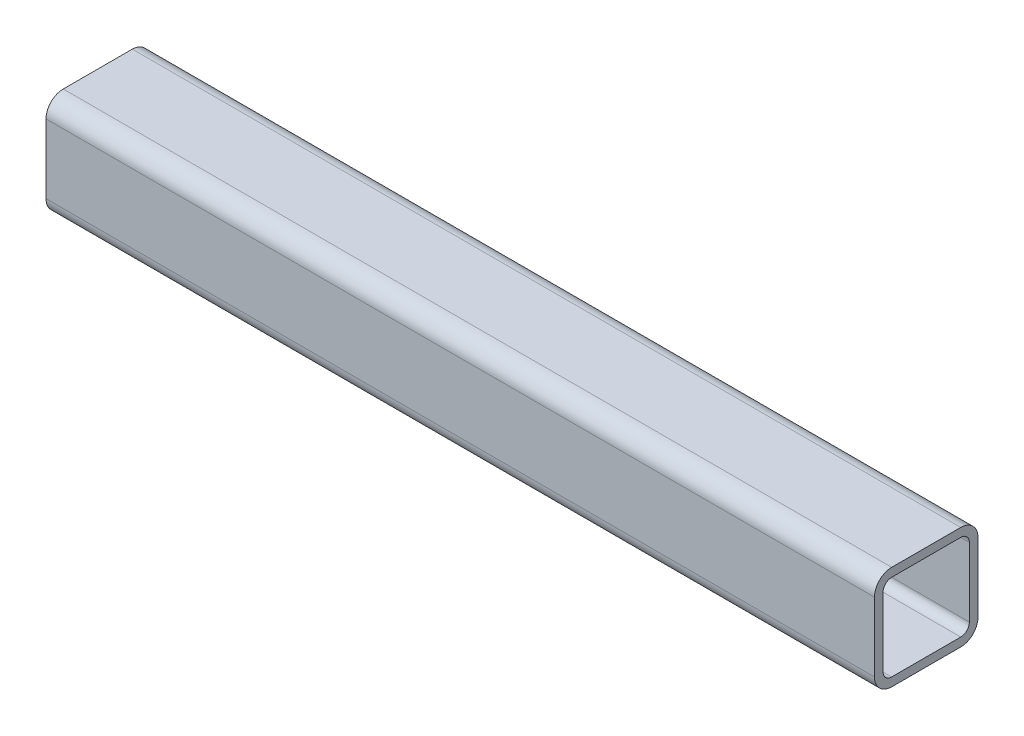
ISO-10303-21;
HEADER;
FILE_DESCRIPTION(('STEP AP214'),'2;1');
FILE_NAME('part.step','',(''),(''),'','','');
FILE_SCHEMA(('AUTOMOTIVE_DESIGN { 1 0 10303 214 1 1 1 1 }'));
ENDSEC;
DATA;
#1=APPLICATION_CONTEXT('core data for automotive mechanical design processes');
#2=APPLICATION_PROTOCOL_DEFINITION('international standard','automotive_design',2000,#1);
#3=PRODUCT_CONTEXT('',#1,'mechanical');
#4=PRODUCT('Part','Part','',(#3));
#5=PRODUCT_RELATED_PRODUCT_CATEGORY('part','',(#4));
#6=PRODUCT_DEFINITION_FORMATION('','',#4);
#7=PRODUCT_DEFINITION_CONTEXT('part definition',#1,'design');
#8=PRODUCT_DEFINITION('design','',#6,#7);
#9=PRODUCT_DEFINITION_SHAPE('','',#8);
#10=(LENGTH_UNIT() NAMED_UNIT(*) SI_UNIT(.MILLI.,.METRE.));
#11=(NAMED_UNIT(*) PLANE_ANGLE_UNIT() SI_UNIT($,.RADIAN.));
#12=(NAMED_UNIT(*) SI_UNIT($,.STERADIAN.) SOLID_ANGLE_UNIT());
#13=UNCERTAINTY_MEASURE_WITH_UNIT(LENGTH_MEASURE(1.E-05),#10,'distance_accuracy_value','');
#14=(GEOMETRIC_REPRESENTATION_CONTEXT(3) GLOBAL_UNCERTAINTY_ASSIGNED_CONTEXT((#13)) GLOBAL_UNIT_ASSIGNED_CONTEXT((#10,
#11,#12)) REPRESENTATION_CONTEXT('',''));
#15=CARTESIAN_POINT('',(0.,0.,0.));
#16=DIRECTION('',(0.,0.,1.));
#17=DIRECTION('',(1.,0.,0.));
#18=AXIS2_PLACEMENT_3D('',#15,#16,#17);
#19=CARTESIAN_POINT('',(-609.6,25.4,25.4));
#20=DIRECTION('',(1.,0.,0.));
#21=DIRECTION('',(0.,0.,-1.));
#22=AXIS2_PLACEMENT_3D('',#19,#20,#21);
#23=CYLINDRICAL_SURFACE('',#22,12.7);
#24=CARTESIAN_POINT('',(0.,25.4,25.4));
#25=DIRECTION('',(-1.,0.,0.));
#26=DIRECTION('',(0.,0.,1.));
#27=AXIS2_PLACEMENT_3D('',#24,#25,#26);
#28=CIRCLE('',#27,12.7);
#29=CARTESIAN_POINT('',(0.,25.4,38.1));
#30=VERTEX_POINT('',#29);
#31=CARTESIAN_POINT('',(0.,38.1,25.4));
#32=VERTEX_POINT('',#31);
#33=EDGE_CURVE('E233',#30,#32,#28,.T.);
#34=ORIENTED_EDGE('',*,*,#33,.T.);
#35=DIRECTION('',(1.,0.,0.));
#36=VECTOR('',#35,1.);
#37=CARTESIAN_POINT('',(-609.6,38.1,25.4));
#38=LINE('',#37,#36);
#39=CARTESIAN_POINT('',(-609.6,38.1,25.4));
#40=VERTEX_POINT('',#39);
#41=EDGE_CURVE('E12',#40,#32,#38,.T.);
#42=ORIENTED_EDGE('',*,*,#41,.F.);
#43=CARTESIAN_POINT('',(-609.6,25.4,25.4));
#44=DIRECTION('',(-1.,0.,0.));
#45=DIRECTION('',(0.,0.,1.));
#46=AXIS2_PLACEMENT_3D('',#43,#44,#45);
#47=CIRCLE('',#46,12.7);
#48=CARTESIAN_POINT('',(-609.6,25.4,38.1));
#49=VERTEX_POINT('',#48);
#50=EDGE_CURVE('E311',#49,#40,#47,.T.);
#51=ORIENTED_EDGE('',*,*,#50,.F.);
#52=DIRECTION('',(1.,0.,0.));
#53=VECTOR('',#52,1.);
#54=CARTESIAN_POINT('',(-609.6,25.4,38.1));
#55=LINE('',#54,#53);
#56=EDGE_CURVE('E248',#49,#30,#55,.T.);
#57=ORIENTED_EDGE('',*,*,#56,.T.);
#58=EDGE_LOOP('',(#34,#42,#51,#57));
#59=FACE_BOUND('',#58,.T.);
#60=ADVANCED_FACE('F61',(#59),#23,.T.);
#61=CARTESIAN_POINT('',(-609.6,38.1,25.4));
#62=DIRECTION('',(0.,-1.,0.));
#63=DIRECTION('',(0.,0.,-1.));
#64=AXIS2_PLACEMENT_3D('',#61,#62,#63);
#65=PLANE('',#64);
#66=DIRECTION('',(0.,0.,-1.));
#67=VECTOR('',#66,1.);
#68=CARTESIAN_POINT('',(0.,38.1,25.4));
#69=LINE('',#68,#67);
#70=CARTESIAN_POINT('',(0.,38.1,-25.4));
#71=VERTEX_POINT('',#70);
#72=EDGE_CURVE('E236',#32,#71,#69,.T.);
#73=ORIENTED_EDGE('',*,*,#72,.T.);
#74=DIRECTION('',(1.,0.,0.));
#75=VECTOR('',#74,1.);
#76=CARTESIAN_POINT('',(-609.6,38.1,-25.4));
#77=LINE('',#76,#75);
#78=CARTESIAN_POINT('',(-609.6,38.1,-25.4));
#79=VERTEX_POINT('',#78);
#80=EDGE_CURVE('E71',#79,#71,#77,.T.);
#81=ORIENTED_EDGE('',*,*,#80,.F.);
#82=DIRECTION('',(0.,0.,-1.));
#83=VECTOR('',#82,1.);
#84=CARTESIAN_POINT('',(-609.6,38.1,25.4));
#85=LINE('',#84,#83);
#86=EDGE_CURVE('E313',#40,#79,#85,.T.);
#87=ORIENTED_EDGE('',*,*,#86,.F.);
#88=ORIENTED_EDGE('',*,*,#41,.T.);
#89=EDGE_LOOP('',(#73,#81,#87,#88));
#90=FACE_BOUND('',#89,.T.);
#91=ADVANCED_FACE('F348',(#90),#65,.F.);
#92=CARTESIAN_POINT('',(-609.6,25.4,-25.4));
#93=DIRECTION('',(1.,0.,0.));
#94=DIRECTION('',(0.,0.,-1.));
#95=AXIS2_PLACEMENT_3D('',#92,#93,#94);
#96=CYLINDRICAL_SURFACE('',#95,12.7);
#97=CARTESIAN_POINT('',(0.,25.4,-25.4));
#98=DIRECTION('',(-1.,0.,0.));
#99=DIRECTION('',(0.,0.,1.));
#100=AXIS2_PLACEMENT_3D('',#97,#98,#99);
#101=CIRCLE('',#100,12.7);
#102=CARTESIAN_POINT('',(0.,25.4,-38.1));
#103=VERTEX_POINT('',#102);
#104=EDGE_CURVE('E238',#71,#103,#101,.T.);
#105=ORIENTED_EDGE('',*,*,#104,.T.);
#106=DIRECTION('',(1.,0.,0.));
#107=VECTOR('',#106,1.);
#108=CARTESIAN_POINT('',(-609.6,25.4,-38.1));
#109=LINE('',#108,#107);
#110=CARTESIAN_POINT('',(-609.6,25.4,-38.1));
#111=VERTEX_POINT('',#110);
#112=EDGE_CURVE('E255',#111,#103,#109,.T.);
#113=ORIENTED_EDGE('',*,*,#112,.F.);
#114=CARTESIAN_POINT('',(-609.6,25.4,-25.4));
#115=DIRECTION('',(-1.,0.,0.));
#116=DIRECTION('',(0.,0.,1.));
#117=AXIS2_PLACEMENT_3D('',#114,#115,#116);
#118=CIRCLE('',#117,12.7);
#119=EDGE_CURVE('E315',#79,#111,#118,.T.);
#120=ORIENTED_EDGE('',*,*,#119,.F.);
#121=ORIENTED_EDGE('',*,*,#80,.T.);
#122=EDGE_LOOP('',(#105,#113,#120,#121));
#123=FACE_BOUND('',#122,.T.);
#124=ADVANCED_FACE('F353',(#123),#96,.T.);
#125=CARTESIAN_POINT('',(-609.6,-25.4,-38.1));
#126=DIRECTION('',(0.,0.,1.));
#127=DIRECTION('',(1.,0.,0.));
#128=AXIS2_PLACEMENT_3D('',#125,#126,#127);
#129=PLANE('',#128);
#130=DIRECTION('',(0.,-1.,0.));
#131=VECTOR('',#130,1.);
#132=CARTESIAN_POINT('',(0.,-25.4,-38.1));
#133=LINE('',#132,#131);
#134=CARTESIAN_POINT('',(0.,-25.4,-38.1));
#135=VERTEX_POINT('',#134);
#136=EDGE_CURVE('E240',#103,#135,#133,.T.);
#137=ORIENTED_EDGE('',*,*,#136,.T.);
#138=DIRECTION('',(1.,0.,0.));
#139=VECTOR('',#138,1.);
#140=CARTESIAN_POINT('',(-609.6,-25.4,-38.1));
#141=LINE('',#140,#139);
#142=CARTESIAN_POINT('',(-609.6,-25.4,-38.1));
#143=VERTEX_POINT('',#142);
#144=EDGE_CURVE('E252',#143,#135,#141,.T.);
#145=ORIENTED_EDGE('',*,*,#144,.F.);
#146=DIRECTION('',(0.,-1.,0.));
#147=VECTOR('',#146,1.);
#148=CARTESIAN_POINT('',(-609.6,-25.4,-38.1));
#149=LINE('',#148,#147);
#150=EDGE_CURVE('E317',#111,#143,#149,.T.);
#151=ORIENTED_EDGE('',*,*,#150,.F.);
#152=ORIENTED_EDGE('',*,*,#112,.T.);
#153=EDGE_LOOP('',(#137,#145,#151,#152));
#154=FACE_BOUND('',#153,.T.);
#155=ADVANCED_FACE('F323',(#154),#129,.F.);
#156=CARTESIAN_POINT('',(-609.6,-25.4,-25.4));
#157=DIRECTION('',(1.,0.,0.));
#158=DIRECTION('',(0.,0.,-1.));
#159=AXIS2_PLACEMENT_3D('',#156,#157,#158);
#160=CYLINDRICAL_SURFACE('',#159,12.7);
#161=CARTESIAN_POINT('',(0.,-25.4,-25.4));
#162=DIRECTION('',(-1.,0.,0.));
#163=DIRECTION('',(0.,0.,1.));
#164=AXIS2_PLACEMENT_3D('',#161,#162,#163);
#165=CIRCLE('',#164,12.7);
#166=CARTESIAN_POINT('',(0.,-38.1,-25.4));
#167=VERTEX_POINT('',#166);
#168=EDGE_CURVE('E242',#135,#167,#165,.T.);
#169=ORIENTED_EDGE('',*,*,#168,.T.);
#170=DIRECTION('',(1.,0.,0.));
#171=VECTOR('',#170,1.);
#172=CARTESIAN_POINT('',(-609.6,-38.1,-25.4));
#173=LINE('',#172,#171);
#174=CARTESIAN_POINT('',(-609.6,-38.1,-25.4));
#175=VERTEX_POINT('',#174);
#176=EDGE_CURVE('E200',#175,#167,#173,.T.);
#177=ORIENTED_EDGE('',*,*,#176,.F.);
#178=CARTESIAN_POINT('',(-609.6,-25.4,-25.4));
#179=DIRECTION('',(-1.,0.,0.));
#180=DIRECTION('',(0.,0.,1.));
#181=AXIS2_PLACEMENT_3D('',#178,#179,#180);
#182=CIRCLE('',#181,12.7);
#183=EDGE_CURVE('E191',#143,#175,#182,.T.);
#184=ORIENTED_EDGE('',*,*,#183,.F.);
#185=ORIENTED_EDGE('',*,*,#144,.T.);
#186=EDGE_LOOP('',(#169,#177,#184,#185));
#187=FACE_BOUND('',#186,.T.);
#188=ADVANCED_FACE('F327',(#187),#160,.T.);
#189=CARTESIAN_POINT('',(-609.6,-38.1,-25.4));
#190=DIRECTION('',(0.,1.,0.));
#191=DIRECTION('',(0.,0.,1.));
#192=AXIS2_PLACEMENT_3D('',#189,#190,#191);
#193=PLANE('',#192);
#194=DIRECTION('',(0.,0.,1.));
#195=VECTOR('',#194,1.);
#196=CARTESIAN_POINT('',(0.,-38.1,-25.4));
#197=LINE('',#196,#195);
#198=CARTESIAN_POINT('',(0.,-38.1,25.4));
#199=VERTEX_POINT('',#198);
#200=EDGE_CURVE('E199',#167,#199,#197,.T.);
#201=ORIENTED_EDGE('',*,*,#200,.T.);
#202=DIRECTION('',(1.,0.,0.));
#203=VECTOR('',#202,1.);
#204=CARTESIAN_POINT('',(-609.6,-38.1,25.4));
#205=LINE('',#204,#203);
#206=CARTESIAN_POINT('',(-609.6,-38.1,25.4));
#207=VERTEX_POINT('',#206);
#208=EDGE_CURVE('E196',#207,#199,#205,.T.);
#209=ORIENTED_EDGE('',*,*,#208,.F.);
#210=DIRECTION('',(0.,0.,1.));
#211=VECTOR('',#210,1.);
#212=CARTESIAN_POINT('',(-609.6,-38.1,-25.4));
#213=LINE('',#212,#211);
#214=EDGE_CURVE('E185',#175,#207,#213,.T.);
#215=ORIENTED_EDGE('',*,*,#214,.F.);
#216=ORIENTED_EDGE('',*,*,#176,.T.);
#217=EDGE_LOOP('',(#201,#209,#215,#216));
#218=FACE_BOUND('',#217,.T.);
#219=ADVANCED_FACE('F197',(#218),#193,.F.);
#220=CARTESIAN_POINT('',(-609.6,-25.4,25.4));
#221=DIRECTION('',(1.,0.,0.));
#222=DIRECTION('',(0.,0.,-1.));
#223=AXIS2_PLACEMENT_3D('',#220,#221,#222);
#224=CYLINDRICAL_SURFACE('',#223,12.7);
#225=CARTESIAN_POINT('',(0.,-25.4,25.4));
#226=DIRECTION('',(-1.,0.,0.));
#227=DIRECTION('',(0.,0.,1.));
#228=AXIS2_PLACEMENT_3D('',#225,#226,#227);
#229=CIRCLE('',#228,12.7);
#230=CARTESIAN_POINT('',(0.,-25.4,38.1));
#231=VERTEX_POINT('',#230);
#232=EDGE_CURVE('E133',#199,#231,#229,.T.);
#233=ORIENTED_EDGE('',*,*,#232,.T.);
#234=DIRECTION('',(1.,0.,0.));
#235=VECTOR('',#234,1.);
#236=CARTESIAN_POINT('',(-609.6,-25.4,38.1));
#237=LINE('',#236,#235);
#238=CARTESIAN_POINT('',(-609.6,-25.4,38.1));
#239=VERTEX_POINT('',#238);
#240=EDGE_CURVE('E201',#239,#231,#237,.T.);
#241=ORIENTED_EDGE('',*,*,#240,.F.);
#242=CARTESIAN_POINT('',(-609.6,-25.4,25.4));
#243=DIRECTION('',(-1.,0.,0.));
#244=DIRECTION('',(0.,0.,1.));
#245=AXIS2_PLACEMENT_3D('',#242,#243,#244);
#246=CIRCLE('',#245,12.7);
#247=EDGE_CURVE('E189',#207,#239,#246,.T.);
#248=ORIENTED_EDGE('',*,*,#247,.F.);
#249=ORIENTED_EDGE('',*,*,#208,.T.);
#250=EDGE_LOOP('',(#233,#241,#248,#249));
#251=FACE_BOUND('',#250,.T.);
#252=ADVANCED_FACE('F203',(#251),#224,.T.);
#253=CARTESIAN_POINT('',(-609.6,25.4,-25.4));
#254=DIRECTION('',(1.,0.,0.));
#255=DIRECTION('',(0.,0.,-1.));
#256=AXIS2_PLACEMENT_3D('',#253,#254,#255);
#257=CYLINDRICAL_SURFACE('',#256,6.34999999999999);
#258=CARTESIAN_POINT('',(0.,25.4,-25.4));
#259=DIRECTION('',(-1.,0.,0.));
#260=DIRECTION('',(0.,0.,1.));
#261=AXIS2_PLACEMENT_3D('',#258,#259,#260);
#262=CIRCLE('',#261,6.34999999999999);
#263=CARTESIAN_POINT('',(0.,31.75,-25.4));
#264=VERTEX_POINT('',#263);
#265=CARTESIAN_POINT('',(0.,25.4,-31.75));
#266=VERTEX_POINT('',#265);
#267=EDGE_CURVE('E209',#264,#266,#262,.T.);
#268=ORIENTED_EDGE('',*,*,#267,.F.);
#269=DIRECTION('',(1.,0.,0.));
#270=VECTOR('',#269,1.);
#271=CARTESIAN_POINT('',(-609.6,31.75,-25.4));
#272=LINE('',#271,#270);
#273=CARTESIAN_POINT('',(-609.6,31.75,-25.4));
#274=VERTEX_POINT('',#273);
#275=EDGE_CURVE('E65',#274,#264,#272,.T.);
#276=ORIENTED_EDGE('',*,*,#275,.F.);
#277=CARTESIAN_POINT('',(-609.6,25.4,-25.4));
#278=DIRECTION('',(-1.,0.,0.));
#279=DIRECTION('',(0.,0.,1.));
#280=AXIS2_PLACEMENT_3D('',#277,#278,#279);
#281=CIRCLE('',#280,6.34999999999999);
#282=CARTESIAN_POINT('',(-609.6,25.4,-31.75));
#283=VERTEX_POINT('',#282);
#284=EDGE_CURVE('E247',#274,#283,#281,.T.);
#285=ORIENTED_EDGE('',*,*,#284,.T.);
#286=DIRECTION('',(1.,0.,0.));
#287=VECTOR('',#286,1.);
#288=CARTESIAN_POINT('',(-609.6,25.4,-31.75));
#289=LINE('',#288,#287);
#290=EDGE_CURVE('E205',#283,#266,#289,.T.);
#291=ORIENTED_EDGE('',*,*,#290,.T.);
#292=EDGE_LOOP('',(#268,#276,#285,#291));
#293=FACE_BOUND('',#292,.T.);
#294=ADVANCED_FACE('F63',(#293),#257,.F.);
#295=CARTESIAN_POINT('',(-609.6,31.75,25.4));
#296=DIRECTION('',(0.,-1.,0.));
#297=DIRECTION('',(0.,0.,-1.));
#298=AXIS2_PLACEMENT_3D('',#295,#296,#297);
#299=PLANE('',#298);
#300=DIRECTION('',(0.,0.,-1.));
#301=VECTOR('',#300,1.);
#302=CARTESIAN_POINT('',(0.,31.75,25.4));
#303=LINE('',#302,#301);
#304=CARTESIAN_POINT('',(0.,31.75,25.4));
#305=VERTEX_POINT('',#304);
#306=EDGE_CURVE('E212',#305,#264,#303,.T.);
#307=ORIENTED_EDGE('',*,*,#306,.F.);
#308=DIRECTION('',(1.,0.,0.));
#309=VECTOR('',#308,1.);
#310=CARTESIAN_POINT('',(-609.6,31.75,25.4));
#311=LINE('',#310,#309);
#312=CARTESIAN_POINT('',(-609.6,31.75,25.4));
#313=VERTEX_POINT('',#312);
#314=EDGE_CURVE('E270',#313,#305,#311,.T.);
#315=ORIENTED_EDGE('',*,*,#314,.F.);
#316=DIRECTION('',(0.,0.,-1.));
#317=VECTOR('',#316,1.);
#318=CARTESIAN_POINT('',(-609.6,31.75,25.4));
#319=LINE('',#318,#317);
#320=EDGE_CURVE('E279',#313,#274,#319,.T.);
#321=ORIENTED_EDGE('',*,*,#320,.T.);
#322=ORIENTED_EDGE('',*,*,#275,.T.);
#323=EDGE_LOOP('',(#307,#315,#321,#322));
#324=FACE_BOUND('',#323,.T.);
#325=ADVANCED_FACE('F277',(#324),#299,.T.);
#326=CARTESIAN_POINT('',(-609.6,25.4,25.4));
#327=DIRECTION('',(1.,0.,0.));
#328=DIRECTION('',(0.,0.,-1.));
#329=AXIS2_PLACEMENT_3D('',#326,#327,#328);
#330=CYLINDRICAL_SURFACE('',#329,6.34999999999999);
#331=CARTESIAN_POINT('',(0.,25.4,25.4));
#332=DIRECTION('',(-1.,0.,0.));
#333=DIRECTION('',(0.,0.,1.));
#334=AXIS2_PLACEMENT_3D('',#331,#332,#333);
#335=CIRCLE('',#334,6.34999999999999);
#336=CARTESIAN_POINT('',(0.,25.4,31.75));
#337=VERTEX_POINT('',#336);
#338=EDGE_CURVE('E215',#337,#305,#335,.T.);
#339=ORIENTED_EDGE('',*,*,#338,.F.);
#340=DIRECTION('',(1.,0.,0.));
#341=VECTOR('',#340,1.);
#342=CARTESIAN_POINT('',(-609.6,25.4,31.75));
#343=LINE('',#342,#341);
#344=CARTESIAN_POINT('',(-609.6,25.4,31.75));
#345=VERTEX_POINT('',#344);
#346=EDGE_CURVE('E269',#345,#337,#343,.T.);
#347=ORIENTED_EDGE('',*,*,#346,.F.);
#348=CARTESIAN_POINT('',(-609.6,25.4,25.4));
#349=DIRECTION('',(-1.,0.,0.));
#350=DIRECTION('',(0.,0.,1.));
#351=AXIS2_PLACEMENT_3D('',#348,#349,#350);
#352=CIRCLE('',#351,6.34999999999999);
#353=EDGE_CURVE('E287',#345,#313,#352,.T.);
#354=ORIENTED_EDGE('',*,*,#353,.T.);
#355=ORIENTED_EDGE('',*,*,#314,.T.);
#356=EDGE_LOOP('',(#339,#347,#354,#355));
#357=FACE_BOUND('',#356,.T.);
#358=ADVANCED_FACE('F285',(#357),#330,.F.);
#359=CARTESIAN_POINT('',(-609.6,25.4,31.75));
#360=DIRECTION('',(0.,0.,-1.));
#361=DIRECTION('',(-1.,0.,0.));
#362=AXIS2_PLACEMENT_3D('',#359,#360,#361);
#363=PLANE('',#362);
#364=DIRECTION('',(0.,1.,0.));
#365=VECTOR('',#364,1.);
#366=CARTESIAN_POINT('',(0.,25.4,31.75));
#367=LINE('',#366,#365);
#368=CARTESIAN_POINT('',(0.,-25.4,31.75));
#369=VERTEX_POINT('',#368);
#370=EDGE_CURVE('E218',#369,#337,#367,.T.);
#371=ORIENTED_EDGE('',*,*,#370,.F.);
#372=DIRECTION('',(1.,0.,0.));
#373=VECTOR('',#372,1.);
#374=CARTESIAN_POINT('',(-609.6,-25.4,31.75));
#375=LINE('',#374,#373);
#376=CARTESIAN_POINT('',(-609.6,-25.4,31.75));
#377=VERTEX_POINT('',#376);
#378=EDGE_CURVE('E267',#377,#369,#375,.T.);
#379=ORIENTED_EDGE('',*,*,#378,.F.);
#380=DIRECTION('',(0.,1.,0.));
#381=VECTOR('',#380,1.);
#382=CARTESIAN_POINT('',(-609.6,25.4,31.75));
#383=LINE('',#382,#381);
#384=EDGE_CURVE('E293',#377,#345,#383,.T.);
#385=ORIENTED_EDGE('',*,*,#384,.T.);
#386=ORIENTED_EDGE('',*,*,#346,.T.);
#387=EDGE_LOOP('',(#371,#379,#385,#386));
#388=FACE_BOUND('',#387,.T.);
#389=ADVANCED_FACE('F296',(#388),#363,.T.);
#390=CARTESIAN_POINT('',(-609.6,-25.4,25.4));
#391=DIRECTION('',(1.,0.,0.));
#392=DIRECTION('',(0.,0.,-1.));
#393=AXIS2_PLACEMENT_3D('',#390,#391,#392);
#394=CYLINDRICAL_SURFACE('',#393,6.34999999999999);
#395=CARTESIAN_POINT('',(0.,-25.4,25.4));
#396=DIRECTION('',(-1.,0.,0.));
#397=DIRECTION('',(0.,0.,1.));
#398=AXIS2_PLACEMENT_3D('',#395,#396,#397);
#399=CIRCLE('',#398,6.34999999999999);
#400=CARTESIAN_POINT('',(0.,-31.75,25.4));
#401=VERTEX_POINT('',#400);
#402=EDGE_CURVE('E221',#401,#369,#399,.T.);
#403=ORIENTED_EDGE('',*,*,#402,.F.);
#404=DIRECTION('',(1.,0.,0.));
#405=VECTOR('',#404,1.);
#406=CARTESIAN_POINT('',(-609.6,-31.75,25.4));
#407=LINE('',#406,#405);
#408=CARTESIAN_POINT('',(-609.6,-31.75,25.4));
#409=VERTEX_POINT('',#408);
#410=EDGE_CURVE('E265',#409,#401,#407,.T.);
#411=ORIENTED_EDGE('',*,*,#410,.F.);
#412=CARTESIAN_POINT('',(-609.6,-25.4,25.4));
#413=DIRECTION('',(-1.,0.,0.));
#414=DIRECTION('',(0.,0.,1.));
#415=AXIS2_PLACEMENT_3D('',#412,#413,#414);
#416=CIRCLE('',#415,6.34999999999999);
#417=EDGE_CURVE('E297',#409,#377,#416,.T.);
#418=ORIENTED_EDGE('',*,*,#417,.T.);
#419=ORIENTED_EDGE('',*,*,#378,.T.);
#420=EDGE_LOOP('',(#403,#411,#418,#419));
#421=FACE_BOUND('',#420,.T.);
#422=ADVANCED_FACE('F364',(#421),#394,.F.);
#423=CARTESIAN_POINT('',(-609.6,-31.75,-25.4));
#424=DIRECTION('',(0.,1.,0.));
#425=DIRECTION('',(0.,0.,1.));
#426=AXIS2_PLACEMENT_3D('',#423,#424,#425);
#427=PLANE('',#426);
#428=DIRECTION('',(0.,0.,1.));
#429=VECTOR('',#428,1.);
#430=CARTESIAN_POINT('',(0.,-31.75,-25.4));
#431=LINE('',#430,#429);
#432=CARTESIAN_POINT('',(0.,-31.75,-25.4));
#433=VERTEX_POINT('',#432);
#434=EDGE_CURVE('E224',#433,#401,#431,.T.);
#435=ORIENTED_EDGE('',*,*,#434,.F.);
#436=DIRECTION('',(1.,0.,0.));
#437=VECTOR('',#436,1.);
#438=CARTESIAN_POINT('',(-609.6,-31.75,-25.4));
#439=LINE('',#438,#437);
#440=CARTESIAN_POINT('',(-609.6,-31.75,-25.4));
#441=VERTEX_POINT('',#440);
#442=EDGE_CURVE('E263',#441,#433,#439,.T.);
#443=ORIENTED_EDGE('',*,*,#442,.F.);
#444=DIRECTION('',(0.,0.,1.));
#445=VECTOR('',#444,1.);
#446=CARTESIAN_POINT('',(-609.6,-31.75,-25.4));
#447=LINE('',#446,#445);
#448=EDGE_CURVE('E299',#441,#409,#447,.T.);
#449=ORIENTED_EDGE('',*,*,#448,.T.);
#450=ORIENTED_EDGE('',*,*,#410,.T.);
#451=EDGE_LOOP('',(#435,#443,#449,#450));
#452=FACE_BOUND('',#451,.T.);
#453=ADVANCED_FACE('F360',(#452),#427,.T.);
#454=CARTESIAN_POINT('',(-609.6,-25.4,-25.4));
#455=DIRECTION('',(1.,0.,0.));
#456=DIRECTION('',(0.,0.,-1.));
#457=AXIS2_PLACEMENT_3D('',#454,#455,#456);
#458=CYLINDRICAL_SURFACE('',#457,6.34999999999999);
#459=CARTESIAN_POINT('',(0.,-25.4,-25.4));
#460=DIRECTION('',(-1.,0.,0.));
#461=DIRECTION('',(0.,0.,1.));
#462=AXIS2_PLACEMENT_3D('',#459,#460,#461);
#463=CIRCLE('',#462,6.34999999999999);
#464=CARTESIAN_POINT('',(0.,-25.4,-31.75));
#465=VERTEX_POINT('',#464);
#466=EDGE_CURVE('E227',#465,#433,#463,.T.);
#467=ORIENTED_EDGE('',*,*,#466,.F.);
#468=DIRECTION('',(1.,0.,0.));
#469=VECTOR('',#468,1.);
#470=CARTESIAN_POINT('',(-609.6,-25.4,-31.75));
#471=LINE('',#470,#469);
#472=CARTESIAN_POINT('',(-609.6,-25.4,-31.75));
#473=VERTEX_POINT('',#472);
#474=EDGE_CURVE('E261',#473,#465,#471,.T.);
#475=ORIENTED_EDGE('',*,*,#474,.F.);
#476=CARTESIAN_POINT('',(-609.6,-25.4,-25.4));
#477=DIRECTION('',(-1.,0.,0.));
#478=DIRECTION('',(0.,0.,1.));
#479=AXIS2_PLACEMENT_3D('',#476,#477,#478);
#480=CIRCLE('',#479,6.34999999999999);
#481=EDGE_CURVE('E305',#473,#441,#480,.T.);
#482=ORIENTED_EDGE('',*,*,#481,.T.);
#483=ORIENTED_EDGE('',*,*,#442,.T.);
#484=EDGE_LOOP('',(#467,#475,#482,#483));
#485=FACE_BOUND('',#484,.T.);
#486=ADVANCED_FACE('F342',(#485),#458,.F.);
#487=CARTESIAN_POINT('',(-609.6,-25.4,-31.75));
#488=DIRECTION('',(0.,0.,1.));
#489=DIRECTION('',(1.,0.,0.));
#490=AXIS2_PLACEMENT_3D('',#487,#488,#489);
#491=PLANE('',#490);
#492=DIRECTION('',(0.,-1.,0.));
#493=VECTOR('',#492,1.);
#494=CARTESIAN_POINT('',(0.,-25.4,-31.75));
#495=LINE('',#494,#493);
#496=EDGE_CURVE('E230',#266,#465,#495,.T.);
#497=ORIENTED_EDGE('',*,*,#496,.F.);
#498=ORIENTED_EDGE('',*,*,#290,.F.);
#499=DIRECTION('',(0.,-1.,0.));
#500=VECTOR('',#499,1.);
#501=CARTESIAN_POINT('',(-609.6,-25.4,-31.75));
#502=LINE('',#501,#500);
#503=EDGE_CURVE('E308',#283,#473,#502,.T.);
#504=ORIENTED_EDGE('',*,*,#503,.T.);
#505=ORIENTED_EDGE('',*,*,#474,.T.);
#506=EDGE_LOOP('',(#497,#498,#504,#505));
#507=FACE_BOUND('',#506,.T.);
#508=ADVANCED_FACE('F335',(#507),#491,.T.);
#509=CARTESIAN_POINT('',(-609.6,25.4,38.1));
#510=DIRECTION('',(0.,0.,-1.));
#511=DIRECTION('',(-1.,0.,0.));
#512=AXIS2_PLACEMENT_3D('',#509,#510,#511);
#513=PLANE('',#512);
#514=DIRECTION('',(0.,1.,0.));
#515=VECTOR('',#514,1.);
#516=CARTESIAN_POINT('',(0.,25.4,38.1));
#517=LINE('',#516,#515);
#518=EDGE_CURVE('E139',#231,#30,#517,.T.);
#519=ORIENTED_EDGE('',*,*,#518,.T.);
#520=ORIENTED_EDGE('',*,*,#56,.F.);
#521=DIRECTION('',(0.,1.,0.));
#522=VECTOR('',#521,1.);
#523=CARTESIAN_POINT('',(-609.6,25.4,38.1));
#524=LINE('',#523,#522);
#525=EDGE_CURVE('E80',#239,#49,#524,.T.);
#526=ORIENTED_EDGE('',*,*,#525,.F.);
#527=ORIENTED_EDGE('',*,*,#240,.T.);
#528=EDGE_LOOP('',(#519,#520,#526,#527));
#529=FACE_BOUND('',#528,.T.);
#530=ADVANCED_FACE('F333',(#529),#513,.F.);
#531=CARTESIAN_POINT('',(-609.6,25.4,25.4));
#532=DIRECTION('',(-1.,0.,0.));
#533=DIRECTION('',(0.,0.,1.));
#534=AXIS2_PLACEMENT_3D('',#531,#532,#533);
#535=PLANE('',#534);
#536=ORIENTED_EDGE('',*,*,#284,.F.);
#537=ORIENTED_EDGE('',*,*,#320,.F.);
#538=ORIENTED_EDGE('',*,*,#353,.F.);
#539=ORIENTED_EDGE('',*,*,#384,.F.);
#540=ORIENTED_EDGE('',*,*,#417,.F.);
#541=ORIENTED_EDGE('',*,*,#448,.F.);
#542=ORIENTED_EDGE('',*,*,#481,.F.);
#543=ORIENTED_EDGE('',*,*,#503,.F.);
#544=EDGE_LOOP('',(#536,#537,#538,#539,#540,#541,#542,#543));
#545=FACE_BOUND('',#544,.T.);
#546=ORIENTED_EDGE('',*,*,#50,.T.);
#547=ORIENTED_EDGE('',*,*,#86,.T.);
#548=ORIENTED_EDGE('',*,*,#119,.T.);
#549=ORIENTED_EDGE('',*,*,#150,.T.);
#550=ORIENTED_EDGE('',*,*,#183,.T.);
#551=ORIENTED_EDGE('',*,*,#214,.T.);
#552=ORIENTED_EDGE('',*,*,#247,.T.);
#553=ORIENTED_EDGE('',*,*,#525,.T.);
#554=EDGE_LOOP('',(#546,#547,#548,#549,#550,#551,#552,#553));
#555=FACE_BOUND('',#554,.T.);
#556=ADVANCED_FACE('F187',(#545,#555),#535,.T.);
#557=CARTESIAN_POINT('',(0.,25.4,25.4));
#558=DIRECTION('',(-1.,0.,0.));
#559=DIRECTION('',(0.,0.,1.));
#560=AXIS2_PLACEMENT_3D('',#557,#558,#559);
#561=PLANE('',#560);
#562=ORIENTED_EDGE('',*,*,#267,.T.);
#563=ORIENTED_EDGE('',*,*,#496,.T.);
#564=ORIENTED_EDGE('',*,*,#466,.T.);
#565=ORIENTED_EDGE('',*,*,#434,.T.);
#566=ORIENTED_EDGE('',*,*,#402,.T.);
#567=ORIENTED_EDGE('',*,*,#370,.T.);
#568=ORIENTED_EDGE('',*,*,#338,.T.);
#569=ORIENTED_EDGE('',*,*,#306,.T.);
#570=EDGE_LOOP('',(#562,#563,#564,#565,#566,#567,#568,#569));
#571=FACE_BOUND('',#570,.T.);
#572=ORIENTED_EDGE('',*,*,#33,.F.);
#573=ORIENTED_EDGE('',*,*,#518,.F.);
#574=ORIENTED_EDGE('',*,*,#232,.F.);
#575=ORIENTED_EDGE('',*,*,#200,.F.);
#576=ORIENTED_EDGE('',*,*,#168,.F.);
#577=ORIENTED_EDGE('',*,*,#136,.F.);
#578=ORIENTED_EDGE('',*,*,#104,.F.);
#579=ORIENTED_EDGE('',*,*,#72,.F.);
#580=EDGE_LOOP('',(#572,#573,#574,#575,#576,#577,#578,#579));
#581=FACE_BOUND('',#580,.T.);
#582=ADVANCED_FACE('F282',(#571,#581),#561,.F.);
#583=CLOSED_SHELL('',(#60,#91,#124,#155,#188,#219,#252,#294,#325,#358,#389,#422,#453,#486,#508,
#530,#556,#582));
#584=MANIFOLD_SOLID_BREP('B2',#583);
#585=ADVANCED_BREP_SHAPE_REPRESENTATION('',(#18,#584),#14);
#586=SHAPE_DEFINITION_REPRESENTATION(#9,#585);
ENDSEC;
END-ISO-10303-21;
